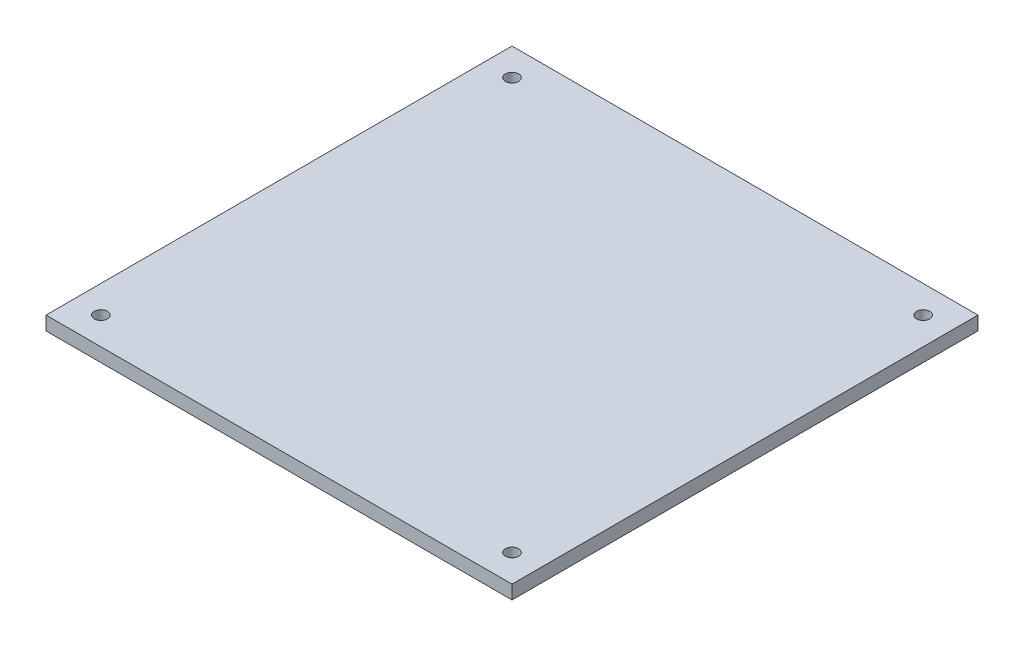
ISO-10303-21;
HEADER;
FILE_DESCRIPTION(('STEP AP214'),'2;1');
FILE_NAME('part.step','',(''),(''),'','','');
FILE_SCHEMA(('AUTOMOTIVE_DESIGN { 1 0 10303 214 1 1 1 1 }'));
ENDSEC;
DATA;
#1=APPLICATION_CONTEXT('core data for automotive mechanical design processes');
#2=APPLICATION_PROTOCOL_DEFINITION('international standard','automotive_design',2000,#1);
#3=PRODUCT_CONTEXT('',#1,'mechanical');
#4=PRODUCT('Part','Part','',(#3));
#5=PRODUCT_RELATED_PRODUCT_CATEGORY('part','',(#4));
#6=PRODUCT_DEFINITION_FORMATION('','',#4);
#7=PRODUCT_DEFINITION_CONTEXT('part definition',#1,'design');
#8=PRODUCT_DEFINITION('design','',#6,#7);
#9=PRODUCT_DEFINITION_SHAPE('','',#8);
#10=(LENGTH_UNIT() NAMED_UNIT(*) SI_UNIT(.MILLI.,.METRE.));
#11=(NAMED_UNIT(*) PLANE_ANGLE_UNIT() SI_UNIT($,.RADIAN.));
#12=(NAMED_UNIT(*) SI_UNIT($,.STERADIAN.) SOLID_ANGLE_UNIT());
#13=UNCERTAINTY_MEASURE_WITH_UNIT(LENGTH_MEASURE(1.E-05),#10,'distance_accuracy_value','');
#14=(GEOMETRIC_REPRESENTATION_CONTEXT(3) GLOBAL_UNCERTAINTY_ASSIGNED_CONTEXT((#13)) GLOBAL_UNIT_ASSIGNED_CONTEXT((#10,
#11,#12)) REPRESENTATION_CONTEXT('',''));
#15=CARTESIAN_POINT('',(0.,0.,0.));
#16=DIRECTION('',(0.,0.,1.));
#17=DIRECTION('',(1.,0.,0.));
#18=AXIS2_PLACEMENT_3D('',#15,#16,#17);
#19=CARTESIAN_POINT('',(42.5,2.5,-42.5));
#20=DIRECTION('',(-1.,0.,0.));
#21=DIRECTION('',(0.,0.,1.));
#22=AXIS2_PLACEMENT_3D('',#19,#20,#21);
#23=PLANE('',#22);
#24=DIRECTION('',(0.,0.,-1.));
#25=VECTOR('',#24,1.);
#26=CARTESIAN_POINT('',(42.5,0.,-42.5));
#27=LINE('',#26,#25);
#28=CARTESIAN_POINT('',(42.5,0.,42.5));
#29=VERTEX_POINT('',#28);
#30=CARTESIAN_POINT('',(42.5,0.,-42.5));
#31=VERTEX_POINT('',#30);
#32=EDGE_CURVE('E113',#29,#31,#27,.T.);
#33=ORIENTED_EDGE('',*,*,#32,.T.);
#34=DIRECTION('',(0.,-1.,0.));
#35=VECTOR('',#34,1.);
#36=CARTESIAN_POINT('',(42.5,2.5,-42.5));
#37=LINE('',#36,#35);
#38=CARTESIAN_POINT('',(42.5,2.5,-42.5));
#39=VERTEX_POINT('',#38);
#40=EDGE_CURVE('E11',#39,#31,#37,.T.);
#41=ORIENTED_EDGE('',*,*,#40,.F.);
#42=DIRECTION('',(0.,0.,-1.));
#43=VECTOR('',#42,1.);
#44=CARTESIAN_POINT('',(42.5,2.5,-42.5));
#45=LINE('',#44,#43);
#46=CARTESIAN_POINT('',(42.5,2.5,42.5));
#47=VERTEX_POINT('',#46);
#48=EDGE_CURVE('E97',#47,#39,#45,.T.);
#49=ORIENTED_EDGE('',*,*,#48,.F.);
#50=DIRECTION('',(0.,-1.,0.));
#51=VECTOR('',#50,1.);
#52=CARTESIAN_POINT('',(42.5,2.5,42.5));
#53=LINE('',#52,#51);
#54=EDGE_CURVE('E109',#47,#29,#53,.T.);
#55=ORIENTED_EDGE('',*,*,#54,.T.);
#56=EDGE_LOOP('',(#33,#41,#49,#55));
#57=FACE_BOUND('',#56,.T.);
#58=ADVANCED_FACE('F45',(#57),#23,.F.);
#59=CARTESIAN_POINT('',(-42.5,2.5,-42.5));
#60=DIRECTION('',(0.,0.,1.));
#61=DIRECTION('',(1.,0.,0.));
#62=AXIS2_PLACEMENT_3D('',#59,#60,#61);
#63=PLANE('',#62);
#64=DIRECTION('',(-1.,0.,0.));
#65=VECTOR('',#64,1.);
#66=CARTESIAN_POINT('',(-42.5,0.,-42.5));
#67=LINE('',#66,#65);
#68=CARTESIAN_POINT('',(-42.5,0.,-42.5));
#69=VERTEX_POINT('',#68);
#70=EDGE_CURVE('E102',#31,#69,#67,.T.);
#71=ORIENTED_EDGE('',*,*,#70,.T.);
#72=DIRECTION('',(0.,-1.,0.));
#73=VECTOR('',#72,1.);
#74=CARTESIAN_POINT('',(-42.5,2.5,-42.5));
#75=LINE('',#74,#73);
#76=CARTESIAN_POINT('',(-42.5,2.5,-42.5));
#77=VERTEX_POINT('',#76);
#78=EDGE_CURVE('E54',#77,#69,#75,.T.);
#79=ORIENTED_EDGE('',*,*,#78,.F.);
#80=DIRECTION('',(-1.,0.,0.));
#81=VECTOR('',#80,1.);
#82=CARTESIAN_POINT('',(-42.5,2.5,-42.5));
#83=LINE('',#82,#81);
#84=EDGE_CURVE('E92',#39,#77,#83,.T.);
#85=ORIENTED_EDGE('',*,*,#84,.F.);
#86=ORIENTED_EDGE('',*,*,#40,.T.);
#87=EDGE_LOOP('',(#71,#79,#85,#86));
#88=FACE_BOUND('',#87,.T.);
#89=ADVANCED_FACE('F101',(#88),#63,.F.);
#90=CARTESIAN_POINT('',(-42.5,2.5,-42.5));
#91=DIRECTION('',(1.,0.,0.));
#92=DIRECTION('',(0.,0.,-1.));
#93=AXIS2_PLACEMENT_3D('',#90,#91,#92);
#94=PLANE('',#93);
#95=DIRECTION('',(0.,0.,1.));
#96=VECTOR('',#95,1.);
#97=CARTESIAN_POINT('',(-42.5,0.,-42.5));
#98=LINE('',#97,#96);
#99=CARTESIAN_POINT('',(-42.5,0.,42.5));
#100=VERTEX_POINT('',#99);
#101=EDGE_CURVE('E79',#69,#100,#98,.T.);
#102=ORIENTED_EDGE('',*,*,#101,.T.);
#103=DIRECTION('',(0.,-1.,0.));
#104=VECTOR('',#103,1.);
#105=CARTESIAN_POINT('',(-42.5,2.5,42.5));
#106=LINE('',#105,#104);
#107=CARTESIAN_POINT('',(-42.5,2.5,42.5));
#108=VERTEX_POINT('',#107);
#109=EDGE_CURVE('E104',#108,#100,#106,.T.);
#110=ORIENTED_EDGE('',*,*,#109,.F.);
#111=DIRECTION('',(0.,0.,1.));
#112=VECTOR('',#111,1.);
#113=CARTESIAN_POINT('',(-42.5,2.5,-42.5));
#114=LINE('',#113,#112);
#115=EDGE_CURVE('E95',#77,#108,#114,.T.);
#116=ORIENTED_EDGE('',*,*,#115,.F.);
#117=ORIENTED_EDGE('',*,*,#78,.T.);
#118=EDGE_LOOP('',(#102,#110,#116,#117));
#119=FACE_BOUND('',#118,.T.);
#120=ADVANCED_FACE('F105',(#119),#94,.F.);
#121=CARTESIAN_POINT('',(-42.5,2.5,42.5));
#122=DIRECTION('',(0.,0.,-1.));
#123=DIRECTION('',(-1.,0.,0.));
#124=AXIS2_PLACEMENT_3D('',#121,#122,#123);
#125=PLANE('',#124);
#126=DIRECTION('',(1.,0.,0.));
#127=VECTOR('',#126,1.);
#128=CARTESIAN_POINT('',(-42.5,0.,42.5));
#129=LINE('',#128,#127);
#130=EDGE_CURVE('E85',#100,#29,#129,.T.);
#131=ORIENTED_EDGE('',*,*,#130,.T.);
#132=ORIENTED_EDGE('',*,*,#54,.F.);
#133=DIRECTION('',(1.,0.,0.));
#134=VECTOR('',#133,1.);
#135=CARTESIAN_POINT('',(-42.5,2.5,42.5));
#136=LINE('',#135,#134);
#137=EDGE_CURVE('E62',#108,#47,#136,.T.);
#138=ORIENTED_EDGE('',*,*,#137,.F.);
#139=ORIENTED_EDGE('',*,*,#109,.T.);
#140=EDGE_LOOP('',(#131,#132,#138,#139));
#141=FACE_BOUND('',#140,.T.);
#142=ADVANCED_FACE('F127',(#141),#125,.F.);
#143=CARTESIAN_POINT('',(0.,2.5,0.));
#144=DIRECTION('',(0.,1.,0.));
#145=DIRECTION('',(0.,0.,1.));
#146=AXIS2_PLACEMENT_3D('',#143,#144,#145);
#147=PLANE('',#146);
#148=CARTESIAN_POINT('',(-37.5,2.5,37.5));
#149=DIRECTION('',(0.,1.,0.));
#150=DIRECTION('',(0.,0.,1.));
#151=AXIS2_PLACEMENT_3D('',#148,#149,#150);
#152=CIRCLE('',#151,1.2);
#153=CARTESIAN_POINT('',(-37.5,2.5,38.7));
#154=VERTEX_POINT('',#153);
#155=EDGE_CURVE('E146',#154,#154,#152,.T.);
#156=ORIENTED_EDGE('',*,*,#155,.F.);
#157=EDGE_LOOP('',(#156));
#158=FACE_BOUND('',#157,.T.);
#159=CARTESIAN_POINT('',(37.5,2.5,37.5));
#160=DIRECTION('',(0.,1.,0.));
#161=DIRECTION('',(0.,0.,1.));
#162=AXIS2_PLACEMENT_3D('',#159,#160,#161);
#163=CIRCLE('',#162,1.2);
#164=CARTESIAN_POINT('',(37.5,2.5,38.7));
#165=VERTEX_POINT('',#164);
#166=EDGE_CURVE('E154',#165,#165,#163,.T.);
#167=ORIENTED_EDGE('',*,*,#166,.F.);
#168=EDGE_LOOP('',(#167));
#169=FACE_BOUND('',#168,.T.);
#170=CARTESIAN_POINT('',(37.5,2.5,-37.5));
#171=DIRECTION('',(0.,1.,0.));
#172=DIRECTION('',(0.,0.,1.));
#173=AXIS2_PLACEMENT_3D('',#170,#171,#172);
#174=CIRCLE('',#173,1.2);
#175=CARTESIAN_POINT('',(37.5,2.5,-36.3));
#176=VERTEX_POINT('',#175);
#177=EDGE_CURVE('E138',#176,#176,#174,.T.);
#178=ORIENTED_EDGE('',*,*,#177,.F.);
#179=EDGE_LOOP('',(#178));
#180=FACE_BOUND('',#179,.T.);
#181=CARTESIAN_POINT('',(-37.5,2.5,-37.5));
#182=DIRECTION('',(0.,1.,0.));
#183=DIRECTION('',(0.,0.,1.));
#184=AXIS2_PLACEMENT_3D('',#181,#182,#183);
#185=CIRCLE('',#184,1.2);
#186=CARTESIAN_POINT('',(-37.5,2.5,-36.3));
#187=VERTEX_POINT('',#186);
#188=EDGE_CURVE('E134',#187,#187,#185,.T.);
#189=ORIENTED_EDGE('',*,*,#188,.F.);
#190=EDGE_LOOP('',(#189));
#191=FACE_BOUND('',#190,.T.);
#192=ORIENTED_EDGE('',*,*,#48,.T.);
#193=ORIENTED_EDGE('',*,*,#84,.T.);
#194=ORIENTED_EDGE('',*,*,#115,.T.);
#195=ORIENTED_EDGE('',*,*,#137,.T.);
#196=EDGE_LOOP('',(#192,#193,#194,#195));
#197=FACE_BOUND('',#196,.T.);
#198=ADVANCED_FACE('F93',(#158,#169,#180,#191,#197),#147,.T.);
#199=CARTESIAN_POINT('',(0.,0.,0.));
#200=DIRECTION('',(0.,1.,0.));
#201=DIRECTION('',(0.,0.,1.));
#202=AXIS2_PLACEMENT_3D('',#199,#200,#201);
#203=PLANE('',#202);
#204=CARTESIAN_POINT('',(-37.5,0.,37.5));
#205=DIRECTION('',(0.,1.,0.));
#206=DIRECTION('',(0.,0.,1.));
#207=AXIS2_PLACEMENT_3D('',#204,#205,#206);
#208=CIRCLE('',#207,1.2);
#209=CARTESIAN_POINT('',(-37.5,0.,38.7));
#210=VERTEX_POINT('',#209);
#211=EDGE_CURVE('E142',#210,#210,#208,.T.);
#212=ORIENTED_EDGE('',*,*,#211,.T.);
#213=EDGE_LOOP('',(#212));
#214=FACE_BOUND('',#213,.T.);
#215=CARTESIAN_POINT('',(37.5,0.,37.5));
#216=DIRECTION('',(0.,1.,0.));
#217=DIRECTION('',(0.,0.,1.));
#218=AXIS2_PLACEMENT_3D('',#215,#216,#217);
#219=CIRCLE('',#218,1.2);
#220=CARTESIAN_POINT('',(37.5,0.,38.7));
#221=VERTEX_POINT('',#220);
#222=EDGE_CURVE('E150',#221,#221,#219,.T.);
#223=ORIENTED_EDGE('',*,*,#222,.T.);
#224=EDGE_LOOP('',(#223));
#225=FACE_BOUND('',#224,.T.);
#226=CARTESIAN_POINT('',(37.5,0.,-37.5));
#227=DIRECTION('',(0.,1.,0.));
#228=DIRECTION('',(0.,0.,1.));
#229=AXIS2_PLACEMENT_3D('',#226,#227,#228);
#230=CIRCLE('',#229,1.2);
#231=CARTESIAN_POINT('',(37.5,0.,-36.3));
#232=VERTEX_POINT('',#231);
#233=EDGE_CURVE('E158',#232,#232,#230,.T.);
#234=ORIENTED_EDGE('',*,*,#233,.T.);
#235=EDGE_LOOP('',(#234));
#236=FACE_BOUND('',#235,.T.);
#237=CARTESIAN_POINT('',(-37.5,0.,-37.5));
#238=DIRECTION('',(0.,1.,0.));
#239=DIRECTION('',(0.,0.,1.));
#240=AXIS2_PLACEMENT_3D('',#237,#238,#239);
#241=CIRCLE('',#240,1.2);
#242=CARTESIAN_POINT('',(-37.5,0.,-36.3));
#243=VERTEX_POINT('',#242);
#244=EDGE_CURVE('E117',#243,#243,#241,.T.);
#245=ORIENTED_EDGE('',*,*,#244,.T.);
#246=EDGE_LOOP('',(#245));
#247=FACE_BOUND('',#246,.T.);
#248=ORIENTED_EDGE('',*,*,#32,.F.);
#249=ORIENTED_EDGE('',*,*,#130,.F.);
#250=ORIENTED_EDGE('',*,*,#101,.F.);
#251=ORIENTED_EDGE('',*,*,#70,.F.);
#252=EDGE_LOOP('',(#248,#249,#250,#251));
#253=FACE_BOUND('',#252,.T.);
#254=ADVANCED_FACE('F130',(#214,#225,#236,#247,#253),#203,.F.);
#255=CARTESIAN_POINT('',(-37.5,0.,-37.5));
#256=DIRECTION('',(0.,1.,0.));
#257=DIRECTION('',(0.,0.,1.));
#258=AXIS2_PLACEMENT_3D('',#255,#256,#257);
#259=CYLINDRICAL_SURFACE('',#258,1.2);
#260=ORIENTED_EDGE('',*,*,#244,.F.);
#261=EDGE_LOOP('',(#260));
#262=FACE_BOUND('',#261,.T.);
#263=ORIENTED_EDGE('',*,*,#188,.T.);
#264=EDGE_LOOP('',(#263));
#265=FACE_BOUND('',#264,.T.);
#266=ADVANCED_FACE('F174',(#262,#265),#259,.F.);
#267=CARTESIAN_POINT('',(37.5,0.,-37.5));
#268=DIRECTION('',(0.,1.,0.));
#269=DIRECTION('',(0.,0.,1.));
#270=AXIS2_PLACEMENT_3D('',#267,#268,#269);
#271=CYLINDRICAL_SURFACE('',#270,1.2);
#272=ORIENTED_EDGE('',*,*,#233,.F.);
#273=EDGE_LOOP('',(#272));
#274=FACE_BOUND('',#273,.T.);
#275=ORIENTED_EDGE('',*,*,#177,.T.);
#276=EDGE_LOOP('',(#275));
#277=FACE_BOUND('',#276,.T.);
#278=ADVANCED_FACE('F166',(#274,#277),#271,.F.);
#279=CARTESIAN_POINT('',(37.5,0.,37.5));
#280=DIRECTION('',(0.,1.,0.));
#281=DIRECTION('',(0.,0.,1.));
#282=AXIS2_PLACEMENT_3D('',#279,#280,#281);
#283=CYLINDRICAL_SURFACE('',#282,1.2);
#284=ORIENTED_EDGE('',*,*,#222,.F.);
#285=EDGE_LOOP('',(#284));
#286=FACE_BOUND('',#285,.T.);
#287=ORIENTED_EDGE('',*,*,#166,.T.);
#288=EDGE_LOOP('',(#287));
#289=FACE_BOUND('',#288,.T.);
#290=ADVANCED_FACE('F182',(#286,#289),#283,.F.);
#291=CARTESIAN_POINT('',(-37.5,0.,37.5));
#292=DIRECTION('',(0.,1.,0.));
#293=DIRECTION('',(0.,0.,1.));
#294=AXIS2_PLACEMENT_3D('',#291,#292,#293);
#295=CYLINDRICAL_SURFACE('',#294,1.2);
#296=ORIENTED_EDGE('',*,*,#211,.F.);
#297=EDGE_LOOP('',(#296));
#298=FACE_BOUND('',#297,.T.);
#299=ORIENTED_EDGE('',*,*,#155,.T.);
#300=EDGE_LOOP('',(#299));
#301=FACE_BOUND('',#300,.T.);
#302=ADVANCED_FACE('F233',(#298,#301),#295,.F.);
#303=CLOSED_SHELL('',(#58,#89,#120,#142,#198,#254,#266,#278,#290,#302));
#304=MANIFOLD_SOLID_BREP('B2',#303);
#305=ADVANCED_BREP_SHAPE_REPRESENTATION('',(#18,#304),#14);
#306=SHAPE_DEFINITION_REPRESENTATION(#9,#305);
ENDSEC;
END-ISO-10303-21;
